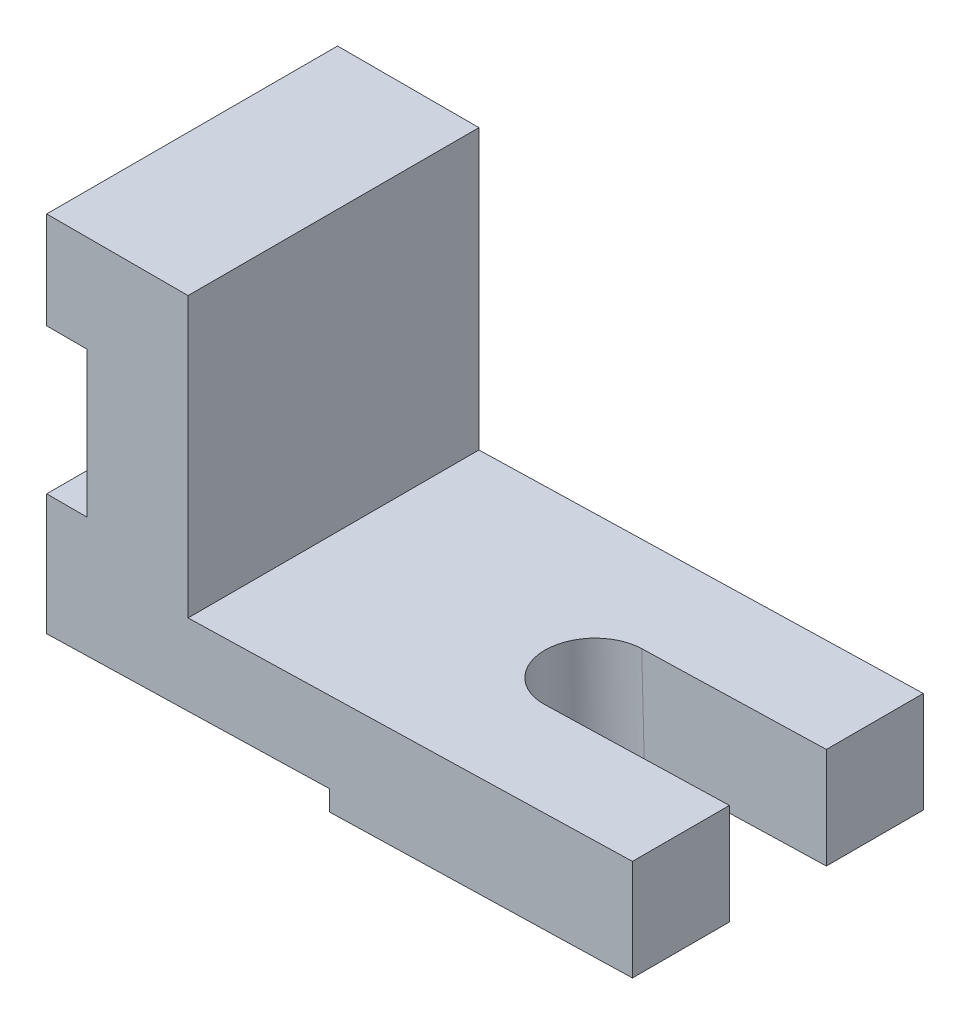
ISO-10303-21;
HEADER;
FILE_DESCRIPTION(('STEP AP214'),'2;1');
FILE_NAME('part.step','',(''),(''),'','','');
FILE_SCHEMA(('AUTOMOTIVE_DESIGN { 1 0 10303 214 1 1 1 1 }'));
ENDSEC;
DATA;
#1=APPLICATION_CONTEXT('core data for automotive mechanical design processes');
#2=APPLICATION_PROTOCOL_DEFINITION('international standard','automotive_design',2000,#1);
#3=PRODUCT_CONTEXT('',#1,'mechanical');
#4=PRODUCT('Part','Part','',(#3));
#5=PRODUCT_RELATED_PRODUCT_CATEGORY('part','',(#4));
#6=PRODUCT_DEFINITION_FORMATION('','',#4);
#7=PRODUCT_DEFINITION_CONTEXT('part definition',#1,'design');
#8=PRODUCT_DEFINITION('design','',#6,#7);
#9=PRODUCT_DEFINITION_SHAPE('','',#8);
#10=(LENGTH_UNIT() NAMED_UNIT(*) SI_UNIT(.MILLI.,.METRE.));
#11=(NAMED_UNIT(*) PLANE_ANGLE_UNIT() SI_UNIT($,.RADIAN.));
#12=(NAMED_UNIT(*) SI_UNIT($,.STERADIAN.) SOLID_ANGLE_UNIT());
#13=UNCERTAINTY_MEASURE_WITH_UNIT(LENGTH_MEASURE(1.E-05),#10,'distance_accuracy_value','');
#14=(GEOMETRIC_REPRESENTATION_CONTEXT(3) GLOBAL_UNCERTAINTY_ASSIGNED_CONTEXT((#13)) GLOBAL_UNIT_ASSIGNED_CONTEXT((#10,
#11,#12)) REPRESENTATION_CONTEXT('',''));
#15=CARTESIAN_POINT('',(0.,0.,0.));
#16=DIRECTION('',(0.,0.,1.));
#17=DIRECTION('',(1.,0.,0.));
#18=AXIS2_PLACEMENT_3D('',#15,#16,#17);
#19=CARTESIAN_POINT('',(70.,-3.21218074656189,-72.));
#20=DIRECTION('',(0.0255319490893442,-0.999674006652018,0.));
#21=DIRECTION('',(0.999674006652018,0.0255319490893442,0.));
#22=AXIS2_PLACEMENT_3D('',#19,#20,#21);
#23=PLANE('',#22);
#24=DIRECTION('',(0.999674006652018,0.0255319490893442,0.));
#25=VECTOR('',#24,1.);
#26=CARTESIAN_POINT('',(70.,-3.21218074656189,-60.));
#27=LINE('',#26,#25);
#28=CARTESIAN_POINT('',(70.,-3.21218074656189,-60.));
#29=VERTEX_POINT('',#28);
#30=CARTESIAN_POINT('',(70.1276181292189,-3.20892134444039,-60.));
#31=VERTEX_POINT('',#30);
#32=EDGE_CURVE('E55',#29,#31,#27,.T.);
#33=ORIENTED_EDGE('',*,*,#32,.T.);
#34=DIRECTION('',(0.,0.,-1.));
#35=VECTOR('',#34,1.);
#36=CARTESIAN_POINT('',(70.1276181292189,-3.20892134444039,-72.));
#37=LINE('',#36,#35);
#38=CARTESIAN_POINT('',(70.1276181292189,-3.20892134444039,-72.));
#39=VERTEX_POINT('',#38);
#40=EDGE_CURVE('E246',#31,#39,#37,.T.);
#41=ORIENTED_EDGE('',*,*,#40,.T.);
#42=DIRECTION('',(0.999674006652018,0.0255319490893442,0.));
#43=VECTOR('',#42,1.);
#44=CARTESIAN_POINT('',(70.,-3.21218074656189,-72.));
#45=LINE('',#44,#43);
#46=CARTESIAN_POINT('',(145.,-1.29666011787821,-72.));
#47=VERTEX_POINT('',#46);
#48=EDGE_CURVE('E383',#39,#47,#45,.T.);
#49=ORIENTED_EDGE('',*,*,#48,.T.);
#50=DIRECTION('',(0.,0.,1.));
#51=VECTOR('',#50,1.);
#52=CARTESIAN_POINT('',(145.,-1.29666011787821,-72.));
#53=LINE('',#52,#51);
#54=CARTESIAN_POINT('',(145.,-1.29666011787821,-47.9989040663904));
#55=VERTEX_POINT('',#54);
#56=EDGE_CURVE('E451',#47,#55,#53,.T.);
#57=ORIENTED_EDGE('',*,*,#56,.T.);
#58=DIRECTION('',(0.999672483586685,0.0255319101898366,-0.00174560066692098));
#59=VECTOR('',#58,1.);
#60=CARTESIAN_POINT('',(70.0421111414598,-3.21110521642638,-47.8680146571781));
#61=LINE('',#60,#59);
#62=CARTESIAN_POINT('',(100.015422813681,-2.44557859218498,-47.9203532317652));
#63=VERTEX_POINT('',#62);
#64=EDGE_CURVE('E48',#63,#55,#61,.T.);
#65=ORIENTED_EDGE('',*,*,#64,.F.);
#66=CARTESIAN_POINT('',(100.036363193034,-2.44504376913668,-35.9203715145092));
#67=DIRECTION('',(0.0255319490893442,-0.999674006652018,0.));
#68=DIRECTION('',(0.999674006652018,0.0255319490893442,0.));
#69=AXIS2_PLACEMENT_3D('',#66,#67,#68);
#70=CIRCLE('',#69,12.);
#71=CARTESIAN_POINT('',(100.057303572386,-2.44450894608838,-23.9203897972533));
#72=VERTEX_POINT('',#71);
#73=EDGE_CURVE('E475',#72,#63,#70,.T.);
#74=ORIENTED_EDGE('',*,*,#73,.F.);
#75=DIRECTION('',(-0.999672483586684,-0.0255319101898366,0.00174560066692106));
#76=VECTOR('',#75,1.);
#77=CARTESIAN_POINT('',(70.0839919001649,-3.21003557032978,-23.8680512226662));
#78=LINE('',#77,#76);
#79=CARTESIAN_POINT('',(145.,-1.29666011787821,-23.9988675008466));
#80=VERTEX_POINT('',#79);
#81=EDGE_CURVE('E469',#80,#72,#78,.T.);
#82=ORIENTED_EDGE('',*,*,#81,.F.);
#83=CARTESIAN_POINT('',(145.,-1.29666011787821,0.));
#84=VERTEX_POINT('',#83);
#85=EDGE_CURVE('E455',#80,#84,#53,.T.);
#86=ORIENTED_EDGE('',*,*,#85,.T.);
#87=DIRECTION('',(0.999674006652018,0.0255319490893442,0.));
#88=VECTOR('',#87,1.);
#89=CARTESIAN_POINT('',(70.,-3.21218074656189,0.));
#90=LINE('',#89,#88);
#91=CARTESIAN_POINT('',(70.,-3.21218074656189,0.));
#92=VERTEX_POINT('',#91);
#93=EDGE_CURVE('E416',#92,#84,#90,.T.);
#94=ORIENTED_EDGE('',*,*,#93,.F.);
#95=DIRECTION('',(0.,0.,1.));
#96=VECTOR('',#95,1.);
#97=CARTESIAN_POINT('',(70.,-3.21218074656189,-72.));
#98=LINE('',#97,#96);
#99=EDGE_CURVE('E456',#29,#92,#98,.T.);
#100=ORIENTED_EDGE('',*,*,#99,.F.);
#101=EDGE_LOOP('',(#33,#41,#49,#57,#65,#74,#82,#86,#94,#100));
#102=FACE_BOUND('',#101,.T.);
#103=ADVANCED_FACE('F39',(#102),#23,.T.);
#104=CARTESIAN_POINT('',(70.,1.78781925343811,-72.));
#105=DIRECTION('',(-1.,0.,0.));
#106=DIRECTION('',(0.,0.,1.));
#107=AXIS2_PLACEMENT_3D('',#104,#105,#106);
#108=PLANE('',#107);
#109=DIRECTION('',(0.,0.,1.));
#110=VECTOR('',#109,1.);
#111=CARTESIAN_POINT('',(70.,1.78781925343811,-72.));
#112=LINE('',#111,#110);
#113=CARTESIAN_POINT('',(70.,1.78781925343811,-60.));
#114=VERTEX_POINT('',#113);
#115=CARTESIAN_POINT('',(70.,1.78781925343811,0.));
#116=VERTEX_POINT('',#115);
#117=EDGE_CURVE('E459',#114,#116,#112,.T.);
#118=ORIENTED_EDGE('',*,*,#117,.F.);
#119=DIRECTION('',(0.,-1.,0.));
#120=VECTOR('',#119,1.);
#121=CARTESIAN_POINT('',(70.,1.78781925343811,-60.));
#122=LINE('',#121,#120);
#123=EDGE_CURVE('E63',#114,#29,#122,.T.);
#124=ORIENTED_EDGE('',*,*,#123,.T.);
#125=ORIENTED_EDGE('',*,*,#99,.T.);
#126=DIRECTION('',(0.,-1.,0.));
#127=VECTOR('',#126,1.);
#128=CARTESIAN_POINT('',(70.,1.78781925343811,0.));
#129=LINE('',#128,#127);
#130=EDGE_CURVE('E412',#116,#92,#129,.T.);
#131=ORIENTED_EDGE('',*,*,#130,.F.);
#132=EDGE_LOOP('',(#118,#124,#125,#131));
#133=FACE_BOUND('',#132,.T.);
#134=ADVANCED_FACE('F512',(#133),#108,.T.);
#135=CARTESIAN_POINT('',(0.,0.,-72.));
#136=DIRECTION('',(0.0255319490893442,-0.999674006652018,0.));
#137=DIRECTION('',(0.999674006652018,0.0255319490893442,0.));
#138=AXIS2_PLACEMENT_3D('',#135,#136,#137);
#139=PLANE('',#138);
#140=DIRECTION('',(0.,0.,1.));
#141=VECTOR('',#140,1.);
#142=CARTESIAN_POINT('',(0.,0.,-72.));
#143=LINE('',#142,#141);
#144=CARTESIAN_POINT('',(0.,0.,-60.));
#145=VERTEX_POINT('',#144);
#146=CARTESIAN_POINT('',(0.,0.,0.));
#147=VERTEX_POINT('',#146);
#148=EDGE_CURVE('E403',#145,#147,#143,.T.);
#149=ORIENTED_EDGE('',*,*,#148,.F.);
#150=DIRECTION('',(-0.999674006652018,-0.0255319490893442,0.));
#151=VECTOR('',#150,1.);
#152=CARTESIAN_POINT('',(0.,0.,-60.));
#153=LINE('',#152,#151);
#154=EDGE_CURVE('E240',#114,#145,#153,.T.);
#155=ORIENTED_EDGE('',*,*,#154,.F.);
#156=ORIENTED_EDGE('',*,*,#117,.T.);
#157=DIRECTION('',(0.999674006652018,0.0255319490893442,0.));
#158=VECTOR('',#157,1.);
#159=CARTESIAN_POINT('',(0.,0.,0.));
#160=LINE('',#159,#158);
#161=EDGE_CURVE('E408',#147,#116,#160,.T.);
#162=ORIENTED_EDGE('',*,*,#161,.F.);
#163=EDGE_LOOP('',(#149,#155,#156,#162));
#164=FACE_BOUND('',#163,.T.);
#165=ADVANCED_FACE('F509',(#164),#139,.T.);
#166=CARTESIAN_POINT('',(145.,-1.29666011787821,-72.));
#167=DIRECTION('',(1.,0.,0.));
#168=DIRECTION('',(0.,0.,-1.));
#169=AXIS2_PLACEMENT_3D('',#166,#167,#168);
#170=PLANE('',#169);
#171=DIRECTION('',(0.,0.999999999006818,-4.45686552169969E-05));
#172=VECTOR('',#171,1.);
#173=CARTESIAN_POINT('',(145.,-1.29559042130977,-47.9989041140653));
#174=LINE('',#173,#172);
#175=CARTESIAN_POINT('',(145.,22.8829086674994,-47.9999817172559));
#176=VERTEX_POINT('',#175);
#177=EDGE_CURVE('E286',#55,#176,#174,.T.);
#178=ORIENTED_EDGE('',*,*,#177,.F.);
#179=ORIENTED_EDGE('',*,*,#56,.F.);
#180=DIRECTION('',(0.,1.,0.));
#181=VECTOR('',#180,1.);
#182=CARTESIAN_POINT('',(145.,-1.29666011787821,-72.));
#183=LINE('',#182,#181);
#184=CARTESIAN_POINT('',(145.,23.7033398821218,-72.));
#185=VERTEX_POINT('',#184);
#186=EDGE_CURVE('E387',#47,#185,#183,.T.);
#187=ORIENTED_EDGE('',*,*,#186,.T.);
#188=DIRECTION('',(0.,0.,1.));
#189=VECTOR('',#188,1.);
#190=CARTESIAN_POINT('',(145.,23.7033398821218,-72.));
#191=LINE('',#190,#189);
#192=CARTESIAN_POINT('',(145.,23.7033398821218,-48.));
#193=VERTEX_POINT('',#192);
#194=EDGE_CURVE('E446',#185,#193,#191,.T.);
#195=ORIENTED_EDGE('',*,*,#194,.T.);
#196=CARTESIAN_POINT('',(145.,23.7033398821216,-36.));
#197=DIRECTION('',(1.,0.,0.));
#198=DIRECTION('',(0.,1.,0.));
#199=AXIS2_PLACEMENT_3D('',#196,#197,#198);
#200=ELLIPSE('',#199,469.999370514497,12.);
#201=EDGE_CURVE('E11',#176,#193,#200,.T.);
#202=ORIENTED_EDGE('',*,*,#201,.F.);
#203=EDGE_LOOP('',(#178,#179,#187,#195,#202));
#204=FACE_BOUND('',#203,.T.);
#205=ADVANCED_FACE('F488',(#204),#170,.T.);
#206=CARTESIAN_POINT('',(0.,90.,-72.));
#207=DIRECTION('',(-1.,0.,0.));
#208=DIRECTION('',(0.,-1.,0.));
#209=AXIS2_PLACEMENT_3D('',#206,#207,#208);
#210=PLANE('',#209);
#211=DIRECTION('',(0.,0.,1.));
#212=VECTOR('',#211,1.);
#213=CARTESIAN_POINT('',(0.,66.,-72.));
#214=LINE('',#213,#212);
#215=CARTESIAN_POINT('',(0.,66.,-72.));
#216=VERTEX_POINT('',#215);
#217=CARTESIAN_POINT('',(0.,66.,-59.7233225075169));
#218=VERTEX_POINT('',#217);
#219=EDGE_CURVE('E357',#216,#218,#214,.T.);
#220=ORIENTED_EDGE('',*,*,#219,.T.);
#221=CARTESIAN_POINT('',(0.,47.8923820621598,-35.8044142419374));
#222=DIRECTION('',(1.,0.,0.));
#223=DIRECTION('',(0.,0.,-1.));
#224=AXIS2_PLACEMENT_3D('',#221,#222,#223);
#225=CIRCLE('',#224,30.);
#226=CARTESIAN_POINT('',(0.,66.,-11.8855059763578));
#227=VERTEX_POINT('',#226);
#228=EDGE_CURVE('E295',#218,#227,#225,.T.);
#229=ORIENTED_EDGE('',*,*,#228,.T.);
#230=CARTESIAN_POINT('',(0.,66.,0.));
#231=VERTEX_POINT('',#230);
#232=EDGE_CURVE('E362',#227,#231,#214,.T.);
#233=ORIENTED_EDGE('',*,*,#232,.T.);
#234=DIRECTION('',(0.,-1.,0.));
#235=VECTOR('',#234,1.);
#236=CARTESIAN_POINT('',(0.,90.,0.));
#237=LINE('',#236,#235);
#238=CARTESIAN_POINT('',(0.,90.,0.));
#239=VERTEX_POINT('',#238);
#240=EDGE_CURVE('E404',#239,#231,#237,.T.);
#241=ORIENTED_EDGE('',*,*,#240,.F.);
#242=DIRECTION('',(0.,0.,1.));
#243=VECTOR('',#242,1.);
#244=CARTESIAN_POINT('',(0.,90.,-72.));
#245=LINE('',#244,#243);
#246=CARTESIAN_POINT('',(0.,90.,-72.));
#247=VERTEX_POINT('',#246);
#248=EDGE_CURVE('E436',#247,#239,#245,.T.);
#249=ORIENTED_EDGE('',*,*,#248,.F.);
#250=DIRECTION('',(0.,-1.,0.));
#251=VECTOR('',#250,1.);
#252=CARTESIAN_POINT('',(0.,90.,-72.));
#253=LINE('',#252,#251);
#254=EDGE_CURVE('E379',#247,#216,#253,.T.);
#255=ORIENTED_EDGE('',*,*,#254,.T.);
#256=EDGE_LOOP('',(#220,#229,#233,#241,#249,#255));
#257=FACE_BOUND('',#256,.T.);
#258=ADVANCED_FACE('F41',(#257),#210,.T.);
#259=DIRECTION('',(0.,0.,1.));
#260=VECTOR('',#259,1.);
#261=CARTESIAN_POINT('',(0.,30.,-72.));
#262=LINE('',#261,#260);
#263=CARTESIAN_POINT('',(0.,30.,-11.7240765337219));
#264=VERTEX_POINT('',#263);
#265=CARTESIAN_POINT('',(0.,30.,0.));
#266=VERTEX_POINT('',#265);
#267=EDGE_CURVE('E345',#264,#266,#262,.T.);
#268=ORIENTED_EDGE('',*,*,#267,.F.);
#269=CARTESIAN_POINT('',(0.,47.8923820621598,-35.8044142419374));
#270=DIRECTION('',(1.,0.,0.));
#271=DIRECTION('',(0.,0.,-1.));
#272=AXIS2_PLACEMENT_3D('',#269,#270,#271);
#273=CIRCLE('',#272,30.);
#274=CARTESIAN_POINT('',(0.,30.,-59.8847519501528));
#275=VERTEX_POINT('',#274);
#276=EDGE_CURVE('E289',#264,#275,#273,.T.);
#277=ORIENTED_EDGE('',*,*,#276,.T.);
#278=CARTESIAN_POINT('',(0.,30.,-72.));
#279=VERTEX_POINT('',#278);
#280=EDGE_CURVE('E375',#279,#275,#262,.T.);
#281=ORIENTED_EDGE('',*,*,#280,.F.);
#282=CARTESIAN_POINT('',(0.,0.,-72.));
#283=VERTEX_POINT('',#282);
#284=EDGE_CURVE('E384',#279,#283,#253,.T.);
#285=ORIENTED_EDGE('',*,*,#284,.T.);
#286=EDGE_CURVE('E244',#283,#145,#143,.T.);
#287=ORIENTED_EDGE('',*,*,#286,.T.);
#288=ORIENTED_EDGE('',*,*,#148,.T.);
#289=EDGE_CURVE('E361',#266,#147,#237,.T.);
#290=ORIENTED_EDGE('',*,*,#289,.F.);
#291=EDGE_LOOP('',(#268,#277,#281,#285,#287,#288,#290));
#292=FACE_BOUND('',#291,.T.);
#293=ADVANCED_FACE('F577',(#292),#210,.T.);
#294=CARTESIAN_POINT('',(0.,66.,-72.));
#295=DIRECTION('',(0.,1.,0.));
#296=DIRECTION('',(0.,0.,1.));
#297=AXIS2_PLACEMENT_3D('',#294,#295,#296);
#298=PLANE('',#297);
#299=DIRECTION('',(-1.,0.,0.));
#300=VECTOR('',#299,1.);
#301=CARTESIAN_POINT('',(12.,66.,-59.7233225075169));
#302=LINE('',#301,#300);
#303=CARTESIAN_POINT('',(10.,66.,-59.7233225075169));
#304=VERTEX_POINT('',#303);
#305=EDGE_CURVE('E298',#304,#218,#302,.T.);
#306=ORIENTED_EDGE('',*,*,#305,.T.);
#307=ORIENTED_EDGE('',*,*,#219,.F.);
#308=DIRECTION('',(-1.,0.,0.));
#309=VECTOR('',#308,1.);
#310=CARTESIAN_POINT('',(0.,66.,-72.));
#311=LINE('',#310,#309);
#312=CARTESIAN_POINT('',(10.,66.,-72.));
#313=VERTEX_POINT('',#312);
#314=EDGE_CURVE('E341',#313,#216,#311,.T.);
#315=ORIENTED_EDGE('',*,*,#314,.F.);
#316=DIRECTION('',(0.,0.,1.));
#317=VECTOR('',#316,1.);
#318=CARTESIAN_POINT('',(10.,66.,-72.));
#319=LINE('',#318,#317);
#320=EDGE_CURVE('E363',#313,#304,#319,.T.);
#321=ORIENTED_EDGE('',*,*,#320,.T.);
#322=EDGE_LOOP('',(#306,#307,#315,#321));
#323=FACE_BOUND('',#322,.T.);
#324=ADVANCED_FACE('F535',(#323),#298,.F.);
#325=DIRECTION('',(-1.,0.,0.));
#326=VECTOR('',#325,1.);
#327=CARTESIAN_POINT('',(12.,66.,-11.8855059763578));
#328=LINE('',#327,#326);
#329=CARTESIAN_POINT('',(10.,66.,-11.8855059763578));
#330=VERTEX_POINT('',#329);
#331=EDGE_CURVE('E306',#330,#227,#328,.T.);
#332=ORIENTED_EDGE('',*,*,#331,.F.);
#333=CARTESIAN_POINT('',(10.,66.,0.));
#334=VERTEX_POINT('',#333);
#335=EDGE_CURVE('E368',#330,#334,#319,.T.);
#336=ORIENTED_EDGE('',*,*,#335,.T.);
#337=DIRECTION('',(-1.,0.,0.));
#338=VECTOR('',#337,1.);
#339=CARTESIAN_POINT('',(0.,66.,0.));
#340=LINE('',#339,#338);
#341=EDGE_CURVE('E337',#334,#231,#340,.T.);
#342=ORIENTED_EDGE('',*,*,#341,.T.);
#343=ORIENTED_EDGE('',*,*,#232,.F.);
#344=EDGE_LOOP('',(#332,#336,#342,#343));
#345=FACE_BOUND('',#344,.T.);
#346=ADVANCED_FACE('F592',(#345),#298,.F.);
#347=CARTESIAN_POINT('',(0.,30.,-72.));
#348=DIRECTION('',(0.,-1.,0.));
#349=DIRECTION('',(0.,0.,-1.));
#350=AXIS2_PLACEMENT_3D('',#347,#348,#349);
#351=PLANE('',#350);
#352=DIRECTION('',(-1.,0.,0.));
#353=VECTOR('',#352,1.);
#354=CARTESIAN_POINT('',(12.,30.,-11.724076533722));
#355=LINE('',#354,#353);
#356=CARTESIAN_POINT('',(10.,30.,-11.7240765337219));
#357=VERTEX_POINT('',#356);
#358=EDGE_CURVE('E466',#264,#357,#355,.F.);
#359=ORIENTED_EDGE('',*,*,#358,.F.);
#360=ORIENTED_EDGE('',*,*,#267,.T.);
#361=DIRECTION('',(1.,0.,0.));
#362=VECTOR('',#361,1.);
#363=CARTESIAN_POINT('',(0.,30.,0.));
#364=LINE('',#363,#362);
#365=CARTESIAN_POINT('',(10.,30.,0.));
#366=VERTEX_POINT('',#365);
#367=EDGE_CURVE('E346',#266,#366,#364,.T.);
#368=ORIENTED_EDGE('',*,*,#367,.T.);
#369=DIRECTION('',(0.,0.,1.));
#370=VECTOR('',#369,1.);
#371=CARTESIAN_POINT('',(10.,30.,-72.));
#372=LINE('',#371,#370);
#373=EDGE_CURVE('E374',#357,#366,#372,.T.);
#374=ORIENTED_EDGE('',*,*,#373,.F.);
#375=EDGE_LOOP('',(#359,#360,#368,#374));
#376=FACE_BOUND('',#375,.T.);
#377=ADVANCED_FACE('F598',(#376),#351,.F.);
#378=DIRECTION('',(-1.,0.,0.));
#379=VECTOR('',#378,1.);
#380=CARTESIAN_POINT('',(12.,30.,-59.8847519501528));
#381=LINE('',#380,#379);
#382=CARTESIAN_POINT('',(10.,30.,-59.8847519501528));
#383=VERTEX_POINT('',#382);
#384=EDGE_CURVE('E439',#383,#275,#381,.T.);
#385=ORIENTED_EDGE('',*,*,#384,.F.);
#386=CARTESIAN_POINT('',(10.,30.,-72.));
#387=VERTEX_POINT('',#386);
#388=EDGE_CURVE('E369',#387,#383,#372,.T.);
#389=ORIENTED_EDGE('',*,*,#388,.F.);
#390=DIRECTION('',(1.,0.,0.));
#391=VECTOR('',#390,1.);
#392=CARTESIAN_POINT('',(0.,30.,-72.));
#393=LINE('',#392,#391);
#394=EDGE_CURVE('E332',#279,#387,#393,.T.);
#395=ORIENTED_EDGE('',*,*,#394,.F.);
#396=ORIENTED_EDGE('',*,*,#280,.T.);
#397=EDGE_LOOP('',(#385,#389,#395,#396));
#398=FACE_BOUND('',#397,.T.);
#399=ADVANCED_FACE('F581',(#398),#351,.F.);
#400=CARTESIAN_POINT('',(35.,90.,-72.));
#401=DIRECTION('',(0.,1.,0.));
#402=DIRECTION('',(0.,0.,1.));
#403=AXIS2_PLACEMENT_3D('',#400,#401,#402);
#404=PLANE('',#403);
#405=DIRECTION('',(-1.,0.,0.));
#406=VECTOR('',#405,1.);
#407=CARTESIAN_POINT('',(35.,90.,0.));
#408=LINE('',#407,#406);
#409=CARTESIAN_POINT('',(35.,90.,0.));
#410=VERTEX_POINT('',#409);
#411=EDGE_CURVE('E432',#410,#239,#408,.T.);
#412=ORIENTED_EDGE('',*,*,#411,.F.);
#413=DIRECTION('',(0.,0.,1.));
#414=VECTOR('',#413,1.);
#415=CARTESIAN_POINT('',(35.,90.,-72.));
#416=LINE('',#415,#414);
#417=CARTESIAN_POINT('',(35.,90.,-72.));
#418=VERTEX_POINT('',#417);
#419=EDGE_CURVE('E440',#418,#410,#416,.T.);
#420=ORIENTED_EDGE('',*,*,#419,.F.);
#421=DIRECTION('',(-1.,0.,0.));
#422=VECTOR('',#421,1.);
#423=CARTESIAN_POINT('',(35.,90.,-72.));
#424=LINE('',#423,#422);
#425=EDGE_CURVE('E399',#418,#247,#424,.T.);
#426=ORIENTED_EDGE('',*,*,#425,.T.);
#427=ORIENTED_EDGE('',*,*,#248,.T.);
#428=EDGE_LOOP('',(#412,#420,#426,#427));
#429=FACE_BOUND('',#428,.T.);
#430=ADVANCED_FACE('F548',(#429),#404,.T.);
#431=CARTESIAN_POINT('',(35.,20.893909626719,-72.));
#432=DIRECTION('',(1.,0.,0.));
#433=DIRECTION('',(0.,0.,-1.));
#434=AXIS2_PLACEMENT_3D('',#431,#432,#433);
#435=PLANE('',#434);
#436=DIRECTION('',(0.,1.,0.));
#437=VECTOR('',#436,1.);
#438=CARTESIAN_POINT('',(35.,20.893909626719,0.));
#439=LINE('',#438,#437);
#440=CARTESIAN_POINT('',(35.,20.893909626719,0.));
#441=VERTEX_POINT('',#440);
#442=EDGE_CURVE('E428',#441,#410,#439,.T.);
#443=ORIENTED_EDGE('',*,*,#442,.F.);
#444=DIRECTION('',(0.,0.,1.));
#445=VECTOR('',#444,1.);
#446=CARTESIAN_POINT('',(35.,20.893909626719,-72.));
#447=LINE('',#446,#445);
#448=CARTESIAN_POINT('',(35.,20.893909626719,-72.));
#449=VERTEX_POINT('',#448);
#450=EDGE_CURVE('E443',#449,#441,#447,.T.);
#451=ORIENTED_EDGE('',*,*,#450,.F.);
#452=DIRECTION('',(0.,1.,0.));
#453=VECTOR('',#452,1.);
#454=CARTESIAN_POINT('',(35.,20.893909626719,-72.));
#455=LINE('',#454,#453);
#456=EDGE_CURVE('E395',#449,#418,#455,.T.);
#457=ORIENTED_EDGE('',*,*,#456,.T.);
#458=ORIENTED_EDGE('',*,*,#419,.T.);
#459=EDGE_LOOP('',(#443,#451,#457,#458));
#460=FACE_BOUND('',#459,.T.);
#461=ADVANCED_FACE('F551',(#460),#435,.T.);
#462=CARTESIAN_POINT('',(145.,23.7033398821218,-72.));
#463=DIRECTION('',(-0.0255319490893443,0.999674006652018,0.));
#464=DIRECTION('',(-0.999674006652018,-0.0255319490893443,0.));
#465=AXIS2_PLACEMENT_3D('',#462,#463,#464);
#466=PLANE('',#465);
#467=CARTESIAN_POINT('',(145.,23.7033398821218,-36.));
#468=DIRECTION('',(-0.0255319490893443,0.999674006652018,0.));
#469=DIRECTION('',(-0.999674006652018,-0.0255319490893443,0.));
#470=AXIS2_PLACEMENT_3D('',#467,#468,#469);
#471=CIRCLE('',#470,12.);
#472=CARTESIAN_POINT('',(144.979059620647,23.7028050590735,-47.9999817172559));
#473=VERTEX_POINT('',#472);
#474=EDGE_CURVE('E266',#193,#473,#471,.T.);
#475=ORIENTED_EDGE('',*,*,#474,.F.);
#476=ORIENTED_EDGE('',*,*,#194,.F.);
#477=DIRECTION('',(-0.999674006652018,-0.0255319490893443,0.));
#478=VECTOR('',#477,1.);
#479=CARTESIAN_POINT('',(145.,23.7033398821218,-72.));
#480=LINE('',#479,#478);
#481=EDGE_CURVE('E391',#185,#449,#480,.T.);
#482=ORIENTED_EDGE('',*,*,#481,.T.);
#483=ORIENTED_EDGE('',*,*,#450,.T.);
#484=DIRECTION('',(-0.999674006652018,-0.0255319490893443,0.));
#485=VECTOR('',#484,1.);
#486=CARTESIAN_POINT('',(145.,23.7033398821218,0.));
#487=LINE('',#486,#485);
#488=CARTESIAN_POINT('',(145.,23.7033398821218,0.));
#489=VERTEX_POINT('',#488);
#490=EDGE_CURVE('E424',#489,#441,#487,.T.);
#491=ORIENTED_EDGE('',*,*,#490,.F.);
#492=CARTESIAN_POINT('',(145.,23.7033398821218,-23.9999817172281));
#493=VERTEX_POINT('',#492);
#494=EDGE_CURVE('E450',#493,#489,#191,.T.);
#495=ORIENTED_EDGE('',*,*,#494,.F.);
#496=DIRECTION('',(0.999672483586684,0.0255319101898368,-0.00174560066692106));
#497=VECTOR('',#496,1.);
#498=CARTESIAN_POINT('',(99.4192129262916,22.5391940433041,-23.9203897972533));
#499=LINE('',#498,#497);
#500=CARTESIAN_POINT('',(99.4192129262916,22.5391940433041,-23.9203897972533));
#501=VERTEX_POINT('',#500);
#502=EDGE_CURVE('E263',#501,#493,#499,.T.);
#503=ORIENTED_EDGE('',*,*,#502,.F.);
#504=CARTESIAN_POINT('',(99.398272546939,22.5386592202558,-35.9203715145092));
#505=DIRECTION('',(-0.0255319490893443,0.999674006652018,0.));
#506=DIRECTION('',(-0.999674006652018,-0.0255319490893443,0.));
#507=AXIS2_PLACEMENT_3D('',#504,#505,#506);
#508=CIRCLE('',#507,12.);
#509=CARTESIAN_POINT('',(99.3773321675865,22.5381243972075,-47.9203532317652));
#510=VERTEX_POINT('',#509);
#511=EDGE_CURVE('E259',#510,#501,#508,.T.);
#512=ORIENTED_EDGE('',*,*,#511,.F.);
#513=DIRECTION('',(-0.999672483586684,-0.0255319101898367,0.00174560066692098));
#514=VECTOR('',#513,1.);
#515=CARTESIAN_POINT('',(99.3773321675865,22.5381243972075,-47.9203532317652));
#516=LINE('',#515,#514);
#517=EDGE_CURVE('E269',#473,#510,#516,.T.);
#518=ORIENTED_EDGE('',*,*,#517,.F.);
#519=EDGE_LOOP('',(#475,#476,#482,#483,#491,#495,#503,#512,#518));
#520=FACE_BOUND('',#519,.T.);
#521=ADVANCED_FACE('F554',(#520),#466,.T.);
#522=DIRECTION('',(0.,-0.999999999006818,4.45686552169988E-05));
#523=VECTOR('',#522,1.);
#524=CARTESIAN_POINT('',(145.,-1.29452077195595,-23.9988675961943));
#525=LINE('',#524,#523);
#526=EDGE_CURVE('E277',#493,#80,#525,.T.);
#527=ORIENTED_EDGE('',*,*,#526,.F.);
#528=ORIENTED_EDGE('',*,*,#494,.T.);
#529=DIRECTION('',(0.,1.,0.));
#530=VECTOR('',#529,1.);
#531=CARTESIAN_POINT('',(145.,-1.29666011787821,0.));
#532=LINE('',#531,#530);
#533=EDGE_CURVE('E420',#84,#489,#532,.T.);
#534=ORIENTED_EDGE('',*,*,#533,.F.);
#535=ORIENTED_EDGE('',*,*,#85,.F.);
#536=EDGE_LOOP('',(#527,#528,#534,#535));
#537=FACE_BOUND('',#536,.T.);
#538=ADVANCED_FACE('F571',(#537),#170,.T.);
#539=CARTESIAN_POINT('',(0.,0.,-72.));
#540=DIRECTION('',(0.,0.,-1.));
#541=DIRECTION('',(-1.,0.,0.));
#542=AXIS2_PLACEMENT_3D('',#539,#540,#541);
#543=PLANE('',#542);
#544=ORIENTED_EDGE('',*,*,#48,.F.);
#545=DIRECTION('',(-0.0255319490893442,0.999674006652018,0.));
#546=VECTOR('',#545,1.);
#547=CARTESIAN_POINT('',(70.1276597454467,-3.21055077982198,-72.));
#548=LINE('',#547,#546);
#549=CARTESIAN_POINT('',(70.1276597454467,-3.21055077982198,-72.));
#550=VERTEX_POINT('',#549);
#551=EDGE_CURVE('E225',#550,#39,#548,.T.);
#552=ORIENTED_EDGE('',*,*,#551,.F.);
#553=DIRECTION('',(0.999674006652018,0.0255319490893442,0.));
#554=VECTOR('',#553,1.);
#555=CARTESIAN_POINT('',(0.127659745446721,-4.99837003326009,-72.));
#556=LINE('',#555,#554);
#557=CARTESIAN_POINT('',(0.127659745446721,-4.99837003326009,-72.));
#558=VERTEX_POINT('',#557);
#559=EDGE_CURVE('E216',#558,#550,#556,.T.);
#560=ORIENTED_EDGE('',*,*,#559,.F.);
#561=DIRECTION('',(-0.0255319490893442,0.999674006652018,0.));
#562=VECTOR('',#561,1.);
#563=CARTESIAN_POINT('',(0.127659745446721,-4.99837003326009,-72.));
#564=LINE('',#563,#562);
#565=EDGE_CURVE('E222',#558,#283,#564,.T.);
#566=ORIENTED_EDGE('',*,*,#565,.T.);
#567=ORIENTED_EDGE('',*,*,#284,.F.);
#568=ORIENTED_EDGE('',*,*,#394,.T.);
#569=DIRECTION('',(0.,1.,0.));
#570=VECTOR('',#569,1.);
#571=CARTESIAN_POINT('',(10.,66.,-72.));
#572=LINE('',#571,#570);
#573=EDGE_CURVE('E336',#387,#313,#572,.T.);
#574=ORIENTED_EDGE('',*,*,#573,.T.);
#575=ORIENTED_EDGE('',*,*,#314,.T.);
#576=ORIENTED_EDGE('',*,*,#254,.F.);
#577=ORIENTED_EDGE('',*,*,#425,.F.);
#578=ORIENTED_EDGE('',*,*,#456,.F.);
#579=ORIENTED_EDGE('',*,*,#481,.F.);
#580=ORIENTED_EDGE('',*,*,#186,.F.);
#581=EDGE_LOOP('',(#544,#552,#560,#566,#567,#568,#574,#575,#576,#577,#578,#579,#580));
#582=FACE_BOUND('',#581,.T.);
#583=ADVANCED_FACE('F219',(#582),#543,.T.);
#584=CARTESIAN_POINT('',(0.,0.,0.));
#585=DIRECTION('',(0.,0.,-1.));
#586=DIRECTION('',(-1.,0.,0.));
#587=AXIS2_PLACEMENT_3D('',#584,#585,#586);
#588=PLANE('',#587);
#589=ORIENTED_EDGE('',*,*,#240,.T.);
#590=ORIENTED_EDGE('',*,*,#341,.F.);
#591=DIRECTION('',(0.,1.,0.));
#592=VECTOR('',#591,1.);
#593=CARTESIAN_POINT('',(10.,66.,0.));
#594=LINE('',#593,#592);
#595=EDGE_CURVE('E350',#366,#334,#594,.T.);
#596=ORIENTED_EDGE('',*,*,#595,.F.);
#597=ORIENTED_EDGE('',*,*,#367,.F.);
#598=ORIENTED_EDGE('',*,*,#289,.T.);
#599=ORIENTED_EDGE('',*,*,#161,.T.);
#600=ORIENTED_EDGE('',*,*,#130,.T.);
#601=ORIENTED_EDGE('',*,*,#93,.T.);
#602=ORIENTED_EDGE('',*,*,#533,.T.);
#603=ORIENTED_EDGE('',*,*,#490,.T.);
#604=ORIENTED_EDGE('',*,*,#442,.T.);
#605=ORIENTED_EDGE('',*,*,#411,.T.);
#606=EDGE_LOOP('',(#589,#590,#596,#597,#598,#599,#600,#601,#602,#603,#604,#605));
#607=FACE_BOUND('',#606,.T.);
#608=ADVANCED_FACE('F516',(#607),#588,.F.);
#609=CARTESIAN_POINT('',(10.,66.,-72.));
#610=DIRECTION('',(1.,0.,0.));
#611=DIRECTION('',(0.,1.,0.));
#612=AXIS2_PLACEMENT_3D('',#609,#610,#611);
#613=PLANE('',#612);
#614=CARTESIAN_POINT('',(10.,47.8923820621598,-35.8044142419374));
#615=DIRECTION('',(1.,0.,0.));
#616=DIRECTION('',(0.,1.,0.));
#617=AXIS2_PLACEMENT_3D('',#614,#615,#616);
#618=CIRCLE('',#617,12.);
#619=CARTESIAN_POINT('',(10.,59.8923820621598,-35.8044142419374));
#620=VERTEX_POINT('',#619);
#621=EDGE_CURVE('E331',#620,#620,#618,.F.);
#622=ORIENTED_EDGE('',*,*,#621,.F.);
#623=EDGE_LOOP('',(#622));
#624=FACE_BOUND('',#623,.T.);
#625=ORIENTED_EDGE('',*,*,#595,.T.);
#626=ORIENTED_EDGE('',*,*,#335,.F.);
#627=EDGE_CURVE('E367',#304,#330,#319,.T.);
#628=ORIENTED_EDGE('',*,*,#627,.F.);
#629=ORIENTED_EDGE('',*,*,#320,.F.);
#630=ORIENTED_EDGE('',*,*,#573,.F.);
#631=ORIENTED_EDGE('',*,*,#388,.T.);
#632=EDGE_CURVE('E373',#383,#357,#372,.T.);
#633=ORIENTED_EDGE('',*,*,#632,.T.);
#634=ORIENTED_EDGE('',*,*,#373,.T.);
#635=EDGE_LOOP('',(#625,#626,#628,#629,#630,#631,#633,#634));
#636=FACE_BOUND('',#635,.T.);
#637=ADVANCED_FACE('F583',(#624,#636),#613,.F.);
#638=CARTESIAN_POINT('',(12.,30.,-59.8847519501528));
#639=DIRECTION('',(0.,-1.,0.));
#640=DIRECTION('',(0.,0.,-1.));
#641=AXIS2_PLACEMENT_3D('',#638,#639,#640);
#642=PLANE('',#641);
#643=ORIENTED_EDGE('',*,*,#632,.F.);
#644=DIRECTION('',(-1.,0.,0.));
#645=VECTOR('',#644,1.);
#646=CARTESIAN_POINT('',(12.,30.,-59.8847519501528));
#647=LINE('',#646,#645);
#648=CARTESIAN_POINT('',(12.,30.,-59.8847519501528));
#649=VERTEX_POINT('',#648);
#650=EDGE_CURVE('E302',#649,#383,#647,.T.);
#651=ORIENTED_EDGE('',*,*,#650,.F.);
#652=DIRECTION('',(0.,0.,1.));
#653=VECTOR('',#652,1.);
#654=CARTESIAN_POINT('',(12.,30.,-59.8847519501528));
#655=LINE('',#654,#653);
#656=CARTESIAN_POINT('',(12.,30.,-11.7240765337219));
#657=VERTEX_POINT('',#656);
#658=EDGE_CURVE('E316',#649,#657,#655,.T.);
#659=ORIENTED_EDGE('',*,*,#658,.T.);
#660=DIRECTION('',(-1.,0.,0.));
#661=VECTOR('',#660,1.);
#662=CARTESIAN_POINT('',(12.,30.,-11.7240765337219));
#663=LINE('',#662,#661);
#664=EDGE_CURVE('E319',#657,#357,#663,.T.);
#665=ORIENTED_EDGE('',*,*,#664,.T.);
#666=EDGE_LOOP('',(#643,#651,#659,#665));
#667=FACE_BOUND('',#666,.T.);
#668=ADVANCED_FACE('F605',(#667),#642,.T.);
#669=CARTESIAN_POINT('',(12.,47.8923820621598,-35.8044142419374));
#670=DIRECTION('',(-1.,0.,0.));
#671=DIRECTION('',(0.,0.,1.));
#672=AXIS2_PLACEMENT_3D('',#669,#670,#671);
#673=CYLINDRICAL_SURFACE('',#672,30.);
#674=ORIENTED_EDGE('',*,*,#276,.F.);
#675=ORIENTED_EDGE('',*,*,#358,.T.);
#676=ORIENTED_EDGE('',*,*,#664,.F.);
#677=CARTESIAN_POINT('',(12.,47.8923820621598,-35.8044142419374));
#678=DIRECTION('',(1.,0.,0.));
#679=DIRECTION('',(0.,0.,-1.));
#680=AXIS2_PLACEMENT_3D('',#677,#678,#679);
#681=CIRCLE('',#680,30.);
#682=EDGE_CURVE('E312',#657,#649,#681,.T.);
#683=ORIENTED_EDGE('',*,*,#682,.T.);
#684=ORIENTED_EDGE('',*,*,#650,.T.);
#685=ORIENTED_EDGE('',*,*,#384,.T.);
#686=EDGE_LOOP('',(#674,#675,#676,#683,#684,#685));
#687=FACE_BOUND('',#686,.T.);
#688=ADVANCED_FACE('F600',(#687),#673,.F.);
#689=CARTESIAN_POINT('',(12.,47.8923820621598,-35.8044142419374));
#690=DIRECTION('',(1.,0.,0.));
#691=DIRECTION('',(0.,0.,-1.));
#692=AXIS2_PLACEMENT_3D('',#689,#690,#691);
#693=PLANE('',#692);
#694=ORIENTED_EDGE('',*,*,#682,.F.);
#695=ORIENTED_EDGE('',*,*,#658,.F.);
#696=EDGE_LOOP('',(#694,#695));
#697=FACE_BOUND('',#696,.T.);
#698=ADVANCED_FACE('F607',(#697),#693,.F.);
#699=CARTESIAN_POINT('',(12.,47.8923820621598,-35.8044142419374));
#700=DIRECTION('',(-1.,0.,0.));
#701=DIRECTION('',(0.,0.,1.));
#702=AXIS2_PLACEMENT_3D('',#699,#700,#701);
#703=CYLINDRICAL_SURFACE('',#702,12.);
#704=CARTESIAN_POINT('',(12.,47.8923820621598,-35.8044142419374));
#705=DIRECTION('',(1.,0.,0.));
#706=DIRECTION('',(0.,0.,-1.));
#707=AXIS2_PLACEMENT_3D('',#704,#705,#706);
#708=CIRCLE('',#707,12.);
#709=CARTESIAN_POINT('',(12.,47.8923820621598,-47.8044142419374));
#710=VERTEX_POINT('',#709);
#711=EDGE_CURVE('E311',#710,#710,#708,.T.);
#712=ORIENTED_EDGE('',*,*,#711,.T.);
#713=EDGE_LOOP('',(#712));
#714=FACE_BOUND('',#713,.T.);
#715=ORIENTED_EDGE('',*,*,#621,.T.);
#716=EDGE_LOOP('',(#715));
#717=FACE_BOUND('',#716,.T.);
#718=ADVANCED_FACE('F609',(#714,#717),#703,.F.);
#719=CARTESIAN_POINT('',(12.,47.8923820621598,-35.8044142419374));
#720=DIRECTION('',(1.,0.,0.));
#721=DIRECTION('',(0.,0.,-1.));
#722=AXIS2_PLACEMENT_3D('',#719,#720,#721);
#723=PLANE('',#722);
#724=ORIENTED_EDGE('',*,*,#711,.F.);
#725=EDGE_LOOP('',(#724));
#726=FACE_BOUND('',#725,.T.);
#727=ADVANCED_FACE('F615',(#726),#723,.F.);
#728=CARTESIAN_POINT('',(12.,66.,-59.7233225075169));
#729=DIRECTION('',(0.,1.,0.));
#730=DIRECTION('',(0.,0.,1.));
#731=AXIS2_PLACEMENT_3D('',#728,#729,#730);
#732=PLANE('',#731);
#733=ORIENTED_EDGE('',*,*,#627,.T.);
#734=CARTESIAN_POINT('',(12.,66.,-11.8855059763578));
#735=VERTEX_POINT('',#734);
#736=EDGE_CURVE('E307',#735,#330,#328,.T.);
#737=ORIENTED_EDGE('',*,*,#736,.F.);
#738=DIRECTION('',(0.,0.,-1.));
#739=VECTOR('',#738,1.);
#740=CARTESIAN_POINT('',(12.,66.,-59.7233225075169));
#741=LINE('',#740,#739);
#742=CARTESIAN_POINT('',(12.,66.,-59.7233225075169));
#743=VERTEX_POINT('',#742);
#744=EDGE_CURVE('E294',#735,#743,#741,.T.);
#745=ORIENTED_EDGE('',*,*,#744,.T.);
#746=EDGE_CURVE('E303',#743,#304,#302,.T.);
#747=ORIENTED_EDGE('',*,*,#746,.T.);
#748=EDGE_LOOP('',(#733,#737,#745,#747));
#749=FACE_BOUND('',#748,.T.);
#750=ADVANCED_FACE('F587',(#749),#732,.T.);
#751=CARTESIAN_POINT('',(12.,47.8923820621598,-35.8044142419374));
#752=DIRECTION('',(-1.,0.,0.));
#753=DIRECTION('',(0.,0.,1.));
#754=AXIS2_PLACEMENT_3D('',#751,#752,#753);
#755=CYLINDRICAL_SURFACE('',#754,30.);
#756=ORIENTED_EDGE('',*,*,#228,.F.);
#757=ORIENTED_EDGE('',*,*,#305,.F.);
#758=ORIENTED_EDGE('',*,*,#746,.F.);
#759=CARTESIAN_POINT('',(12.,47.8923820621598,-35.8044142419374));
#760=DIRECTION('',(1.,0.,0.));
#761=DIRECTION('',(0.,0.,-1.));
#762=AXIS2_PLACEMENT_3D('',#759,#760,#761);
#763=CIRCLE('',#762,30.);
#764=EDGE_CURVE('E290',#743,#735,#763,.T.);
#765=ORIENTED_EDGE('',*,*,#764,.T.);
#766=ORIENTED_EDGE('',*,*,#736,.T.);
#767=ORIENTED_EDGE('',*,*,#331,.T.);
#768=EDGE_LOOP('',(#756,#757,#758,#765,#766,#767));
#769=FACE_BOUND('',#768,.T.);
#770=ADVANCED_FACE('F589',(#769),#755,.F.);
#771=CARTESIAN_POINT('',(12.,47.8923820621598,-35.8044142419374));
#772=DIRECTION('',(1.,0.,0.));
#773=DIRECTION('',(0.,0.,-1.));
#774=AXIS2_PLACEMENT_3D('',#771,#772,#773);
#775=PLANE('',#774);
#776=ORIENTED_EDGE('',*,*,#764,.F.);
#777=ORIENTED_EDGE('',*,*,#744,.F.);
#778=EDGE_LOOP('',(#776,#777));
#779=FACE_BOUND('',#778,.T.);
#780=ADVANCED_FACE('F702',(#779),#775,.F.);
#781=CARTESIAN_POINT('',(100.215294917798,-9.45090899260877,-35.9203715145092));
#782=DIRECTION('',(-0.0255319490893443,0.999674006652018,0.));
#783=DIRECTION('',(-0.999674006652018,-0.0255319490893443,0.));
#784=AXIS2_PLACEMENT_3D('',#781,#782,#783);
#785=CYLINDRICAL_SURFACE('',#784,12.);
#786=ORIENTED_EDGE('',*,*,#73,.T.);
#787=DIRECTION('',(-0.0255319490893443,0.999674006652018,0.));
#788=VECTOR('',#787,1.);
#789=CARTESIAN_POINT('',(100.194354538445,-9.45144381565707,-47.9203532317652));
#790=LINE('',#789,#788);
#791=EDGE_CURVE('E274',#63,#510,#790,.T.);
#792=ORIENTED_EDGE('',*,*,#791,.T.);
#793=ORIENTED_EDGE('',*,*,#511,.T.);
#794=DIRECTION('',(-0.0255319490893443,0.999674006652018,0.));
#795=VECTOR('',#794,1.);
#796=CARTESIAN_POINT('',(100.236235297151,-9.45037416956047,-23.9203897972533));
#797=LINE('',#796,#795);
#798=EDGE_CURVE('E273',#72,#501,#797,.T.);
#799=ORIENTED_EDGE('',*,*,#798,.F.);
#800=EDGE_LOOP('',(#786,#792,#793,#799));
#801=FACE_BOUND('',#800,.T.);
#802=ADVANCED_FACE('F564',(#801),#785,.F.);
#803=CARTESIAN_POINT('',(100.194354538445,-9.45144381565707,-47.9203532317652));
#804=DIRECTION('',(-0.00174503161271533,-4.45685873581519E-05,-0.999998476437995));
#805=DIRECTION('',(-0.999998477431173,0.,0.00174503161444846));
#806=AXIS2_PLACEMENT_3D('',#803,#804,#805);
#807=PLANE('',#806);
#808=ORIENTED_EDGE('',*,*,#177,.T.);
#809=DIRECTION('',(-0.0255319490893443,0.999674006652018,0.));
#810=VECTOR('',#809,1.);
#811=CARTESIAN_POINT('',(145.796081991506,-8.28676315379107,-47.9999817172559));
#812=LINE('',#811,#810);
#813=EDGE_CURVE('E278',#176,#473,#812,.T.);
#814=ORIENTED_EDGE('',*,*,#813,.T.);
#815=ORIENTED_EDGE('',*,*,#517,.T.);
#816=ORIENTED_EDGE('',*,*,#791,.F.);
#817=ORIENTED_EDGE('',*,*,#64,.T.);
#818=EDGE_LOOP('',(#808,#814,#815,#816,#817));
#819=FACE_BOUND('',#818,.T.);
#820=ADVANCED_FACE('F482',(#819),#807,.F.);
#821=CARTESIAN_POINT('',(145.817022370859,-8.28622833074277,-36.));
#822=DIRECTION('',(-0.0255319490893443,0.999674006652018,0.));
#823=DIRECTION('',(-0.999674006652018,-0.0255319490893443,0.));
#824=AXIS2_PLACEMENT_3D('',#821,#822,#823);
#825=CYLINDRICAL_SURFACE('',#824,12.);
#826=ORIENTED_EDGE('',*,*,#201,.T.);
#827=ORIENTED_EDGE('',*,*,#474,.T.);
#828=ORIENTED_EDGE('',*,*,#813,.F.);
#829=EDGE_LOOP('',(#826,#827,#828));
#830=FACE_BOUND('',#829,.T.);
#831=ADVANCED_FACE('F559',(#830),#825,.F.);
#832=CARTESIAN_POINT('',(100.236235297151,-9.45037416956047,-23.9203897972533));
#833=DIRECTION('',(0.00174503161271541,4.45685873581539E-05,0.999998476437995));
#834=DIRECTION('',(0.999998477431173,0.,-0.00174503161444854));
#835=AXIS2_PLACEMENT_3D('',#832,#833,#834);
#836=PLANE('',#835);
#837=ORIENTED_EDGE('',*,*,#526,.T.);
#838=ORIENTED_EDGE('',*,*,#81,.T.);
#839=ORIENTED_EDGE('',*,*,#798,.T.);
#840=ORIENTED_EDGE('',*,*,#502,.T.);
#841=EDGE_LOOP('',(#837,#838,#839,#840));
#842=FACE_BOUND('',#841,.T.);
#843=ADVANCED_FACE('F749',(#842),#836,.F.);
#844=CARTESIAN_POINT('',(0.127659745446721,-4.99837003326009,-72.));
#845=DIRECTION('',(0.999674006652018,0.0255319490893442,0.));
#846=DIRECTION('',(-0.0255319490893442,0.999674006652018,0.));
#847=AXIS2_PLACEMENT_3D('',#844,#845,#846);
#848=PLANE('',#847);
#849=ORIENTED_EDGE('',*,*,#286,.F.);
#850=ORIENTED_EDGE('',*,*,#565,.F.);
#851=DIRECTION('',(0.,0.,-1.));
#852=VECTOR('',#851,1.);
#853=CARTESIAN_POINT('',(0.127659745446721,-4.99837003326009,-72.));
#854=LINE('',#853,#852);
#855=CARTESIAN_POINT('',(0.127659745446721,-4.99837003326009,-60.));
#856=VERTEX_POINT('',#855);
#857=EDGE_CURVE('E230',#856,#558,#854,.T.);
#858=ORIENTED_EDGE('',*,*,#857,.F.);
#859=DIRECTION('',(-0.0255319490893442,0.999674006652018,0.));
#860=VECTOR('',#859,1.);
#861=CARTESIAN_POINT('',(0.127659745446721,-4.99837003326009,-60.));
#862=LINE('',#861,#860);
#863=EDGE_CURVE('E498',#856,#145,#862,.T.);
#864=ORIENTED_EDGE('',*,*,#863,.T.);
#865=EDGE_LOOP('',(#849,#850,#858,#864));
#866=FACE_BOUND('',#865,.T.);
#867=ADVANCED_FACE('F242',(#866),#848,.F.);
#868=CARTESIAN_POINT('',(70.1276597454467,-3.21055077982198,-72.));
#869=DIRECTION('',(-0.999674006652018,-0.0255319490893442,0.));
#870=DIRECTION('',(0.0255319490893442,-0.999674006652018,0.));
#871=AXIS2_PLACEMENT_3D('',#868,#869,#870);
#872=PLANE('',#871);
#873=ORIENTED_EDGE('',*,*,#40,.F.);
#874=DIRECTION('',(-0.0255319490893442,0.999674006652018,0.));
#875=VECTOR('',#874,1.);
#876=CARTESIAN_POINT('',(70.1276597454467,-3.21055077982198,-60.));
#877=LINE('',#876,#875);
#878=CARTESIAN_POINT('',(70.1276597454467,-3.21055077982198,-60.));
#879=VERTEX_POINT('',#878);
#880=EDGE_CURVE('E251',#879,#31,#877,.T.);
#881=ORIENTED_EDGE('',*,*,#880,.F.);
#882=DIRECTION('',(0.,0.,1.));
#883=VECTOR('',#882,1.);
#884=CARTESIAN_POINT('',(70.1276597454467,-3.21055077982198,-72.));
#885=LINE('',#884,#883);
#886=EDGE_CURVE('E229',#550,#879,#885,.T.);
#887=ORIENTED_EDGE('',*,*,#886,.F.);
#888=ORIENTED_EDGE('',*,*,#551,.T.);
#889=EDGE_LOOP('',(#873,#881,#887,#888));
#890=FACE_BOUND('',#889,.T.);
#891=ADVANCED_FACE('F492',(#890),#872,.F.);
#892=CARTESIAN_POINT('',(0.127659745446721,-4.99837003326009,-60.));
#893=DIRECTION('',(0.,0.,-1.));
#894=DIRECTION('',(-1.,0.,0.));
#895=AXIS2_PLACEMENT_3D('',#892,#893,#894);
#896=PLANE('',#895);
#897=ORIENTED_EDGE('',*,*,#32,.F.);
#898=ORIENTED_EDGE('',*,*,#123,.F.);
#899=ORIENTED_EDGE('',*,*,#154,.T.);
#900=ORIENTED_EDGE('',*,*,#863,.F.);
#901=DIRECTION('',(-0.999674006652018,-0.0255319490893442,0.));
#902=VECTOR('',#901,1.);
#903=CARTESIAN_POINT('',(0.127659745446721,-4.99837003326009,-60.));
#904=LINE('',#903,#902);
#905=EDGE_CURVE('E235',#879,#856,#904,.T.);
#906=ORIENTED_EDGE('',*,*,#905,.F.);
#907=ORIENTED_EDGE('',*,*,#880,.T.);
#908=EDGE_LOOP('',(#897,#898,#899,#900,#906,#907));
#909=FACE_BOUND('',#908,.T.);
#910=ADVANCED_FACE('F507',(#909),#896,.F.);
#911=CARTESIAN_POINT('',(0.127659745446721,-4.99837003326009,0.));
#912=DIRECTION('',(-0.0255319490893442,0.999674006652018,0.));
#913=DIRECTION('',(-0.999674006652018,-0.0255319490893442,0.));
#914=AXIS2_PLACEMENT_3D('',#911,#912,#913);
#915=PLANE('',#914);
#916=ORIENTED_EDGE('',*,*,#857,.T.);
#917=ORIENTED_EDGE('',*,*,#559,.T.);
#918=ORIENTED_EDGE('',*,*,#886,.T.);
#919=ORIENTED_EDGE('',*,*,#905,.T.);
#920=EDGE_LOOP('',(#916,#917,#918,#919));
#921=FACE_BOUND('',#920,.T.);
#922=ADVANCED_FACE('F233',(#921),#915,.F.);
#923=CLOSED_SHELL('',(#103,#134,#165,#205,#258,#293,#324,#346,#377,#399,#430,#461,#521,#538,
#583,#608,#637,#668,#688,#698,#718,#727,#750,#770,#780,#802,#820,#831,#843,#867,#891,#910,#922));
#924=MANIFOLD_SOLID_BREP('B2',#923);
#925=ADVANCED_BREP_SHAPE_REPRESENTATION('',(#18,#924),#14);
#926=SHAPE_DEFINITION_REPRESENTATION(#9,#925);
ENDSEC;
END-ISO-10303-21;
